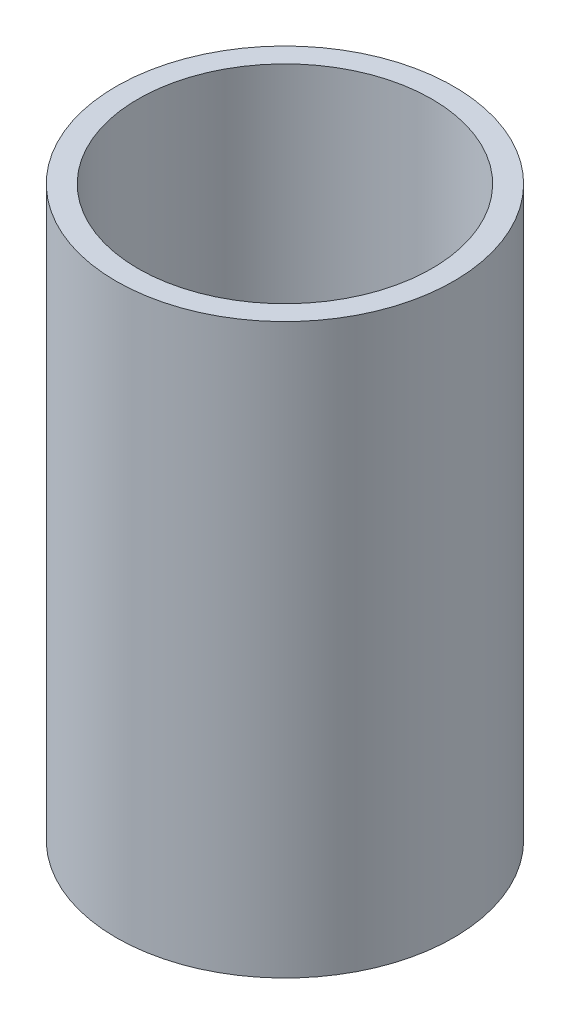
ISO-10303-21;
HEADER;
FILE_DESCRIPTION(('STEP AP214'),'2;1');
FILE_NAME('part.step','',(''),(''),'','','');
FILE_SCHEMA(('AUTOMOTIVE_DESIGN { 1 0 10303 214 1 1 1 1 }'));
ENDSEC;
DATA;
#1=APPLICATION_CONTEXT('core data for automotive mechanical design processes');
#2=APPLICATION_PROTOCOL_DEFINITION('international standard','automotive_design',2000,#1);
#3=PRODUCT_CONTEXT('',#1,'mechanical');
#4=PRODUCT('Part','Part','',(#3));
#5=PRODUCT_RELATED_PRODUCT_CATEGORY('part','',(#4));
#6=PRODUCT_DEFINITION_FORMATION('','',#4);
#7=PRODUCT_DEFINITION_CONTEXT('part definition',#1,'design');
#8=PRODUCT_DEFINITION('design','',#6,#7);
#9=PRODUCT_DEFINITION_SHAPE('','',#8);
#10=(LENGTH_UNIT() NAMED_UNIT(*) SI_UNIT(.MILLI.,.METRE.));
#11=(NAMED_UNIT(*) PLANE_ANGLE_UNIT() SI_UNIT($,.RADIAN.));
#12=(NAMED_UNIT(*) SI_UNIT($,.STERADIAN.) SOLID_ANGLE_UNIT());
#13=UNCERTAINTY_MEASURE_WITH_UNIT(LENGTH_MEASURE(1.E-05),#10,'distance_accuracy_value','');
#14=(GEOMETRIC_REPRESENTATION_CONTEXT(3) GLOBAL_UNCERTAINTY_ASSIGNED_CONTEXT((#13)) GLOBAL_UNIT_ASSIGNED_CONTEXT((#10,
#11,#12)) REPRESENTATION_CONTEXT('',''));
#15=CARTESIAN_POINT('',(0.,0.,0.));
#16=DIRECTION('',(0.,0.,1.));
#17=DIRECTION('',(1.,0.,0.));
#18=AXIS2_PLACEMENT_3D('',#15,#16,#17);
#19=CARTESIAN_POINT('',(2.77555756156289E-13,101.6,4.44089209850063E-13));
#20=DIRECTION('',(0.,-1.,0.));
#21=DIRECTION('',(0.,0.,-1.));
#22=AXIS2_PLACEMENT_3D('',#19,#20,#21);
#23=CYLINDRICAL_SURFACE('',#22,26.2509);
#24=CARTESIAN_POINT('',(2.77555756156289E-13,101.6,4.44089209850063E-13));
#25=DIRECTION('',(0.,1.,0.));
#26=DIRECTION('',(0.,0.,1.));
#27=AXIS2_PLACEMENT_3D('',#24,#25,#26);
#28=CIRCLE('',#27,26.2509);
#29=CARTESIAN_POINT('',(2.77555756156289E-13,101.6,26.2509000000005));
#30=VERTEX_POINT('',#29);
#31=EDGE_CURVE('E49',#30,#30,#28,.T.);
#32=ORIENTED_EDGE('',*,*,#31,.T.);
#33=EDGE_LOOP('',(#32));
#34=FACE_BOUND('',#33,.T.);
#35=CARTESIAN_POINT('',(0.,0.,0.));
#36=DIRECTION('',(0.,1.,0.));
#37=DIRECTION('',(0.,0.,1.));
#38=AXIS2_PLACEMENT_3D('',#35,#36,#37);
#39=CIRCLE('',#38,26.2509);
#40=CARTESIAN_POINT('',(0.,0.,26.2509000000001));
#41=VERTEX_POINT('',#40);
#42=EDGE_CURVE('E55',#41,#41,#39,.T.);
#43=ORIENTED_EDGE('',*,*,#42,.F.);
#44=EDGE_LOOP('',(#43));
#45=FACE_BOUND('',#44,.T.);
#46=ADVANCED_FACE('F42',(#34,#45),#23,.F.);
#47=CARTESIAN_POINT('',(2.77555756156289E-13,101.6,4.44089209850063E-13));
#48=DIRECTION('',(0.,-1.,0.));
#49=DIRECTION('',(0.,0.,-1.));
#50=AXIS2_PLACEMENT_3D('',#47,#48,#49);
#51=CYLINDRICAL_SURFACE('',#50,30.1625);
#52=CARTESIAN_POINT('',(2.77555756156289E-13,101.6,4.44089209850063E-13));
#53=DIRECTION('',(0.,1.,0.));
#54=DIRECTION('',(0.,0.,1.));
#55=AXIS2_PLACEMENT_3D('',#52,#53,#54);
#56=CIRCLE('',#55,30.1625);
#57=CARTESIAN_POINT('',(2.77555756156289E-13,101.6,30.1625000000005));
#58=VERTEX_POINT('',#57);
#59=EDGE_CURVE('E12',#58,#58,#56,.T.);
#60=ORIENTED_EDGE('',*,*,#59,.F.);
#61=EDGE_LOOP('',(#60));
#62=FACE_BOUND('',#61,.T.);
#63=CARTESIAN_POINT('',(0.,0.,0.));
#64=DIRECTION('',(0.,1.,0.));
#65=DIRECTION('',(0.,0.,1.));
#66=AXIS2_PLACEMENT_3D('',#63,#64,#65);
#67=CIRCLE('',#66,30.1625);
#68=CARTESIAN_POINT('',(0.,0.,30.1625000000001));
#69=VERTEX_POINT('',#68);
#70=EDGE_CURVE('E45',#69,#69,#67,.T.);
#71=ORIENTED_EDGE('',*,*,#70,.T.);
#72=EDGE_LOOP('',(#71));
#73=FACE_BOUND('',#72,.T.);
#74=ADVANCED_FACE('F62',(#62,#73),#51,.T.);
#75=CARTESIAN_POINT('',(2.77555756156289E-13,101.6,4.44089209850063E-13));
#76=DIRECTION('',(0.,1.,0.));
#77=DIRECTION('',(0.,0.,1.));
#78=AXIS2_PLACEMENT_3D('',#75,#76,#77);
#79=PLANE('',#78);
#80=ORIENTED_EDGE('',*,*,#31,.F.);
#81=EDGE_LOOP('',(#80));
#82=FACE_BOUND('',#81,.T.);
#83=ORIENTED_EDGE('',*,*,#59,.T.);
#84=EDGE_LOOP('',(#83));
#85=FACE_BOUND('',#84,.T.);
#86=ADVANCED_FACE('F66',(#82,#85),#79,.T.);
#87=CARTESIAN_POINT('',(0.,0.,0.));
#88=DIRECTION('',(0.,1.,0.));
#89=DIRECTION('',(0.,0.,1.));
#90=AXIS2_PLACEMENT_3D('',#87,#88,#89);
#91=PLANE('',#90);
#92=ORIENTED_EDGE('',*,*,#42,.T.);
#93=EDGE_LOOP('',(#92));
#94=FACE_BOUND('',#93,.T.);
#95=ORIENTED_EDGE('',*,*,#70,.F.);
#96=EDGE_LOOP('',(#95));
#97=FACE_BOUND('',#96,.T.);
#98=ADVANCED_FACE('F64',(#94,#97),#91,.F.);
#99=CLOSED_SHELL('',(#46,#74,#86,#98));
#100=MANIFOLD_SOLID_BREP('B2',#99);
#101=ADVANCED_BREP_SHAPE_REPRESENTATION('',(#18,#100),#14);
#102=SHAPE_DEFINITION_REPRESENTATION(#9,#101);
ENDSEC;
END-ISO-10303-21;
